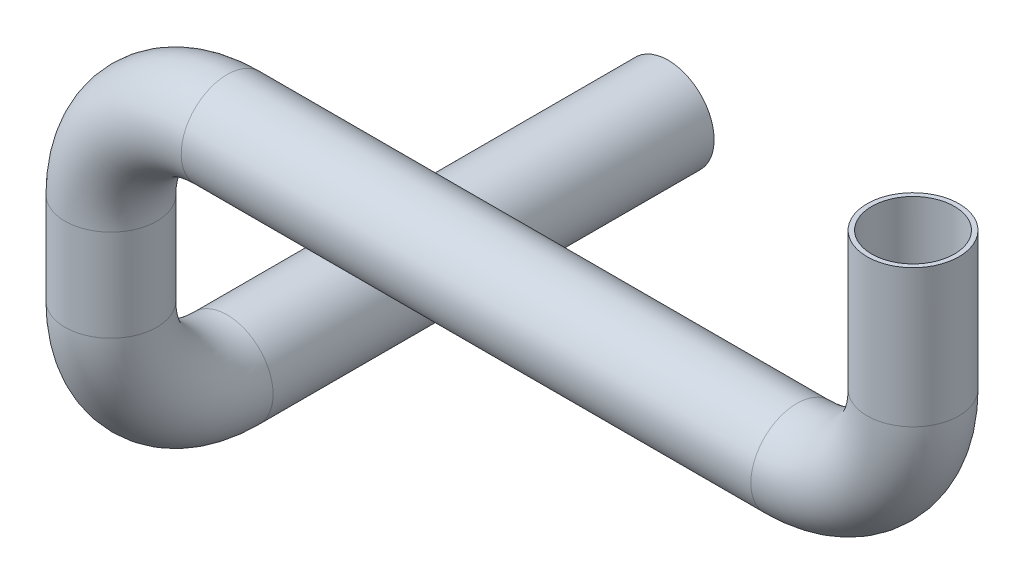
ISO-10303-21;
HEADER;
FILE_DESCRIPTION(('STEP AP214'),'2;1');
FILE_NAME('part.step','',(''),(''),'','','');
FILE_SCHEMA(('AUTOMOTIVE_DESIGN { 1 0 10303 214 1 1 1 1 }'));
ENDSEC;
DATA;
#1=APPLICATION_CONTEXT('core data for automotive mechanical design processes');
#2=APPLICATION_PROTOCOL_DEFINITION('international standard','automotive_design',2000,#1);
#3=PRODUCT_CONTEXT('',#1,'mechanical');
#4=PRODUCT('Part','Part','',(#3));
#5=PRODUCT_RELATED_PRODUCT_CATEGORY('part','',(#4));
#6=PRODUCT_DEFINITION_FORMATION('','',#4);
#7=PRODUCT_DEFINITION_CONTEXT('part definition',#1,'design');
#8=PRODUCT_DEFINITION('design','',#6,#7);
#9=PRODUCT_DEFINITION_SHAPE('','',#8);
#10=(LENGTH_UNIT() NAMED_UNIT(*) SI_UNIT(.MILLI.,.METRE.));
#11=(NAMED_UNIT(*) PLANE_ANGLE_UNIT() SI_UNIT($,.RADIAN.));
#12=(NAMED_UNIT(*) SI_UNIT($,.STERADIAN.) SOLID_ANGLE_UNIT());
#13=UNCERTAINTY_MEASURE_WITH_UNIT(LENGTH_MEASURE(1.E-05),#10,'distance_accuracy_value','');
#14=(GEOMETRIC_REPRESENTATION_CONTEXT(3) GLOBAL_UNCERTAINTY_ASSIGNED_CONTEXT((#13)) GLOBAL_UNIT_ASSIGNED_CONTEXT((#10,
#11,#12)) REPRESENTATION_CONTEXT('',''));
#15=CARTESIAN_POINT('',(0.,0.,0.));
#16=DIRECTION('',(0.,0.,1.));
#17=DIRECTION('',(1.,0.,0.));
#18=AXIS2_PLACEMENT_3D('',#15,#16,#17);
#19=CARTESIAN_POINT('',(87.3,50.3,0.));
#20=DIRECTION('',(0.,1.,0.));
#21=DIRECTION('',(0.,0.,1.));
#22=AXIS2_PLACEMENT_3D('',#19,#20,#21);
#23=PLANE('',#22);
#24=CARTESIAN_POINT('',(87.3,50.3,0.));
#25=DIRECTION('',(0.,1.,0.));
#26=DIRECTION('',(0.,0.,1.));
#27=AXIS2_PLACEMENT_3D('',#24,#25,#26);
#28=CIRCLE('',#27,4.5);
#29=CARTESIAN_POINT('',(87.3,50.3,4.5));
#30=VERTEX_POINT('',#29);
#31=EDGE_CURVE('E61',#30,#30,#28,.T.);
#32=ORIENTED_EDGE('',*,*,#31,.F.);
#33=EDGE_LOOP('',(#32));
#34=FACE_BOUND('',#33,.T.);
#35=CARTESIAN_POINT('',(87.3,50.3,0.));
#36=DIRECTION('',(0.,1.,0.));
#37=DIRECTION('',(0.,0.,1.));
#38=AXIS2_PLACEMENT_3D('',#35,#36,#37);
#39=CIRCLE('',#38,5.);
#40=CARTESIAN_POINT('',(87.3,50.3,5.));
#41=VERTEX_POINT('',#40);
#42=EDGE_CURVE('E10',#41,#41,#39,.T.);
#43=ORIENTED_EDGE('',*,*,#42,.T.);
#44=EDGE_LOOP('',(#43));
#45=FACE_BOUND('',#44,.T.);
#46=ADVANCED_FACE('F30',(#34,#45),#23,.T.);
#47=CARTESIAN_POINT('',(0.,0.,0.));
#48=DIRECTION('',(0.,1.,0.));
#49=DIRECTION('',(0.,0.,1.));
#50=AXIS2_PLACEMENT_3D('',#47,#48,#49);
#51=CYLINDRICAL_SURFACE('',#50,5.);
#52=CARTESIAN_POINT('',(0.,10.,0.));
#53=DIRECTION('',(0.,1.,0.));
#54=DIRECTION('',(0.,0.,1.));
#55=AXIS2_PLACEMENT_3D('',#52,#53,#54);
#56=CIRCLE('',#55,5.);
#57=CARTESIAN_POINT('',(-5.,10.,0.));
#58=VERTEX_POINT('',#57);
#59=EDGE_CURVE('E49',#58,#58,#56,.T.);
#60=ORIENTED_EDGE('',*,*,#59,.F.);
#61=EDGE_LOOP('',(#60));
#62=FACE_BOUND('',#61,.T.);
#63=CARTESIAN_POINT('',(0.,0.,0.));
#64=DIRECTION('',(0.,-1.,0.));
#65=DIRECTION('',(0.,0.,-1.));
#66=AXIS2_PLACEMENT_3D('',#63,#64,#65);
#67=CIRCLE('',#66,5.);
#68=CARTESIAN_POINT('',(0.,0.,5.));
#69=VERTEX_POINT('',#68);
#70=EDGE_CURVE('E58',#69,#69,#67,.T.);
#71=ORIENTED_EDGE('',*,*,#70,.F.);
#72=EDGE_LOOP('',(#71));
#73=FACE_BOUND('',#72,.T.);
#74=ADVANCED_FACE('F127',(#62,#73),#51,.T.);
#75=CARTESIAN_POINT('',(12.65,10.,0.));
#76=DIRECTION('',(0.,0.,-1.));
#77=DIRECTION('',(-1.,0.,0.));
#78=AXIS2_PLACEMENT_3D('',#75,#76,#77);
#79=TOROIDAL_SURFACE('',#78,12.65,5.);
#80=CARTESIAN_POINT('',(12.65,22.65,0.));
#81=DIRECTION('',(1.,0.,0.));
#82=DIRECTION('',(0.,0.,1.));
#83=AXIS2_PLACEMENT_3D('',#80,#81,#82);
#84=CIRCLE('',#83,5.);
#85=CARTESIAN_POINT('',(12.65,27.65,0.));
#86=VERTEX_POINT('',#85);
#87=EDGE_CURVE('E44',#86,#86,#84,.T.);
#88=CARTESIAN_POINT('',(12.65,10.,0.));
#89=DIRECTION('',(0.,0.,-1.));
#90=DIRECTION('',(-1.,0.,0.));
#91=AXIS2_PLACEMENT_3D('',#88,#89,#90);
#92=CIRCLE('',#91,17.65);
#93=EDGE_CURVE('',#58,#86,#92,.T.);
#94=ORIENTED_EDGE('',*,*,#59,.T.);
#95=ORIENTED_EDGE('',*,*,#87,.F.);
#96=ORIENTED_EDGE('',*,*,#93,.T.);
#97=ORIENTED_EDGE('',*,*,#93,.F.);
#98=EDGE_LOOP('',(#94,#96,#95,#97));
#99=FACE_BOUND('',#98,.T.);
#100=ADVANCED_FACE('F123',(#99),#79,.T.);
#101=CARTESIAN_POINT('',(12.65,22.65,0.));
#102=DIRECTION('',(1.,0.,0.));
#103=DIRECTION('',(0.,1.,0.));
#104=AXIS2_PLACEMENT_3D('',#101,#102,#103);
#105=CYLINDRICAL_SURFACE('',#104,5.);
#106=CARTESIAN_POINT('',(74.65,22.65,0.));
#107=DIRECTION('',(1.,0.,0.));
#108=DIRECTION('',(0.,0.,1.));
#109=AXIS2_PLACEMENT_3D('',#106,#107,#108);
#110=CIRCLE('',#109,5.);
#111=CARTESIAN_POINT('',(74.65,17.65,0.));
#112=VERTEX_POINT('',#111);
#113=EDGE_CURVE('E40',#112,#112,#110,.T.);
#114=ORIENTED_EDGE('',*,*,#113,.F.);
#115=EDGE_LOOP('',(#114));
#116=FACE_BOUND('',#115,.T.);
#117=ORIENTED_EDGE('',*,*,#87,.T.);
#118=EDGE_LOOP('',(#117));
#119=FACE_BOUND('',#118,.T.);
#120=ADVANCED_FACE('F117',(#116,#119),#105,.T.);
#121=CARTESIAN_POINT('',(74.65,35.3,0.));
#122=DIRECTION('',(0.,0.,1.));
#123=DIRECTION('',(1.,0.,0.));
#124=AXIS2_PLACEMENT_3D('',#121,#122,#123);
#125=TOROIDAL_SURFACE('',#124,12.65,5.);
#126=CARTESIAN_POINT('',(87.3,35.3,0.));
#127=DIRECTION('',(0.,1.,0.));
#128=DIRECTION('',(0.,0.,1.));
#129=AXIS2_PLACEMENT_3D('',#126,#127,#128);
#130=CIRCLE('',#129,5.);
#131=CARTESIAN_POINT('',(92.3,35.3,0.));
#132=VERTEX_POINT('',#131);
#133=EDGE_CURVE('E36',#132,#132,#130,.T.);
#134=CARTESIAN_POINT('',(74.65,35.3,0.));
#135=DIRECTION('',(0.,0.,1.));
#136=DIRECTION('',(1.,0.,0.));
#137=AXIS2_PLACEMENT_3D('',#134,#135,#136);
#138=CIRCLE('',#137,17.65);
#139=EDGE_CURVE('',#112,#132,#138,.T.);
#140=ORIENTED_EDGE('',*,*,#113,.T.);
#141=ORIENTED_EDGE('',*,*,#133,.F.);
#142=ORIENTED_EDGE('',*,*,#139,.T.);
#143=ORIENTED_EDGE('',*,*,#139,.F.);
#144=EDGE_LOOP('',(#140,#142,#141,#143));
#145=FACE_BOUND('',#144,.T.);
#146=ADVANCED_FACE('F107',(#145),#125,.T.);
#147=CARTESIAN_POINT('',(87.3,35.3,0.));
#148=DIRECTION('',(0.,1.,0.));
#149=DIRECTION('',(0.,0.,1.));
#150=AXIS2_PLACEMENT_3D('',#147,#148,#149);
#151=CYLINDRICAL_SURFACE('',#150,5.);
#152=ORIENTED_EDGE('',*,*,#42,.F.);
#153=EDGE_LOOP('',(#152));
#154=FACE_BOUND('',#153,.T.);
#155=ORIENTED_EDGE('',*,*,#133,.T.);
#156=EDGE_LOOP('',(#155));
#157=FACE_BOUND('',#156,.T.);
#158=ADVANCED_FACE('F104',(#154,#157),#151,.T.);
#159=CARTESIAN_POINT('',(0.,-12.65,-60.65));
#160=DIRECTION('',(0.,0.,-1.));
#161=DIRECTION('',(0.,1.,0.));
#162=AXIS2_PLACEMENT_3D('',#159,#160,#161);
#163=PLANE('',#162);
#164=CARTESIAN_POINT('',(0.,-12.65,-60.65));
#165=DIRECTION('',(0.,0.,-1.));
#166=DIRECTION('',(0.,1.,0.));
#167=AXIS2_PLACEMENT_3D('',#164,#165,#166);
#168=CIRCLE('',#167,4.5);
#169=CARTESIAN_POINT('',(0.,-8.15,-60.65));
#170=VERTEX_POINT('',#169);
#171=EDGE_CURVE('E62',#170,#170,#168,.T.);
#172=ORIENTED_EDGE('',*,*,#171,.F.);
#173=EDGE_LOOP('',(#172));
#174=FACE_BOUND('',#173,.T.);
#175=CARTESIAN_POINT('',(0.,-12.65,-60.65));
#176=DIRECTION('',(0.,0.,-1.));
#177=DIRECTION('',(0.,1.,0.));
#178=AXIS2_PLACEMENT_3D('',#175,#176,#177);
#179=CIRCLE('',#178,5.);
#180=CARTESIAN_POINT('',(0.,-7.65,-60.65));
#181=VERTEX_POINT('',#180);
#182=EDGE_CURVE('E52',#181,#181,#179,.T.);
#183=ORIENTED_EDGE('',*,*,#182,.T.);
#184=EDGE_LOOP('',(#183));
#185=FACE_BOUND('',#184,.T.);
#186=ADVANCED_FACE('F106',(#174,#185),#163,.T.);
#187=CARTESIAN_POINT('',(0.,0.,-12.65));
#188=DIRECTION('',(1.,0.,0.));
#189=DIRECTION('',(0.,0.,-1.));
#190=AXIS2_PLACEMENT_3D('',#187,#188,#189);
#191=TOROIDAL_SURFACE('',#190,12.65,5.);
#192=CARTESIAN_POINT('',(0.,-12.65,-12.65));
#193=DIRECTION('',(0.,0.,-1.));
#194=DIRECTION('',(0.,1.,0.));
#195=AXIS2_PLACEMENT_3D('',#192,#193,#194);
#196=CIRCLE('',#195,5.);
#197=CARTESIAN_POINT('',(0.,-17.65,-12.65));
#198=VERTEX_POINT('',#197);
#199=EDGE_CURVE('E55',#198,#198,#196,.T.);
#200=CARTESIAN_POINT('',(0.,0.,-12.65));
#201=DIRECTION('',(1.,0.,0.));
#202=DIRECTION('',(0.,0.,-1.));
#203=AXIS2_PLACEMENT_3D('',#200,#201,#202);
#204=CIRCLE('',#203,17.65);
#205=EDGE_CURVE('',#69,#198,#204,.T.);
#206=ORIENTED_EDGE('',*,*,#70,.T.);
#207=ORIENTED_EDGE('',*,*,#199,.F.);
#208=ORIENTED_EDGE('',*,*,#205,.T.);
#209=ORIENTED_EDGE('',*,*,#205,.F.);
#210=EDGE_LOOP('',(#206,#208,#207,#209));
#211=FACE_BOUND('',#210,.T.);
#212=ADVANCED_FACE('F113',(#211),#191,.T.);
#213=CARTESIAN_POINT('',(0.,-12.65,-12.65));
#214=DIRECTION('',(0.,0.,-1.));
#215=DIRECTION('',(0.,1.,0.));
#216=AXIS2_PLACEMENT_3D('',#213,#214,#215);
#217=CYLINDRICAL_SURFACE('',#216,5.);
#218=ORIENTED_EDGE('',*,*,#182,.F.);
#219=EDGE_LOOP('',(#218));
#220=FACE_BOUND('',#219,.T.);
#221=ORIENTED_EDGE('',*,*,#199,.T.);
#222=EDGE_LOOP('',(#221));
#223=FACE_BOUND('',#222,.T.);
#224=ADVANCED_FACE('F101',(#220,#223),#217,.T.);
#225=CARTESIAN_POINT('',(0.,0.,0.));
#226=DIRECTION('',(0.,1.,0.));
#227=DIRECTION('',(0.,0.,1.));
#228=AXIS2_PLACEMENT_3D('',#225,#226,#227);
#229=CYLINDRICAL_SURFACE('',#228,4.5);
#230=CARTESIAN_POINT('',(0.,10.,0.));
#231=DIRECTION('',(0.,-1.,0.));
#232=DIRECTION('',(0.,0.,-1.));
#233=AXIS2_PLACEMENT_3D('',#230,#231,#232);
#234=CIRCLE('',#233,4.5);
#235=CARTESIAN_POINT('',(-4.5,10.,0.));
#236=VERTEX_POINT('',#235);
#237=EDGE_CURVE('E65',#236,#236,#234,.F.);
#238=ORIENTED_EDGE('',*,*,#237,.T.);
#239=EDGE_LOOP('',(#238));
#240=FACE_BOUND('',#239,.T.);
#241=CARTESIAN_POINT('',(0.,0.,0.));
#242=DIRECTION('',(0.,1.,0.));
#243=DIRECTION('',(0.,0.,1.));
#244=AXIS2_PLACEMENT_3D('',#241,#242,#243);
#245=CIRCLE('',#244,4.5);
#246=CARTESIAN_POINT('',(0.,0.,4.5));
#247=VERTEX_POINT('',#246);
#248=EDGE_CURVE('E72',#247,#247,#245,.F.);
#249=ORIENTED_EDGE('',*,*,#248,.T.);
#250=EDGE_LOOP('',(#249));
#251=FACE_BOUND('',#250,.T.);
#252=ADVANCED_FACE('F86',(#240,#251),#229,.F.);
#253=CARTESIAN_POINT('',(12.65,10.,0.));
#254=DIRECTION('',(0.,0.,-1.));
#255=DIRECTION('',(-1.,0.,0.));
#256=AXIS2_PLACEMENT_3D('',#253,#254,#255);
#257=TOROIDAL_SURFACE('',#256,12.65,4.5);
#258=CARTESIAN_POINT('',(12.65,22.65,0.));
#259=DIRECTION('',(1.,0.,0.));
#260=DIRECTION('',(0.,1.,0.));
#261=AXIS2_PLACEMENT_3D('',#258,#259,#260);
#262=CIRCLE('',#261,4.5);
#263=CARTESIAN_POINT('',(12.65,27.15,0.));
#264=VERTEX_POINT('',#263);
#265=EDGE_CURVE('E78',#264,#264,#262,.T.);
#266=CARTESIAN_POINT('',(12.65,10.,0.));
#267=DIRECTION('',(0.,0.,-1.));
#268=DIRECTION('',(-1.,0.,0.));
#269=AXIS2_PLACEMENT_3D('',#266,#267,#268);
#270=CIRCLE('',#269,17.15);
#271=EDGE_CURVE('',#236,#264,#270,.T.);
#272=ORIENTED_EDGE('',*,*,#237,.F.);
#273=ORIENTED_EDGE('',*,*,#265,.T.);
#274=ORIENTED_EDGE('',*,*,#271,.T.);
#275=ORIENTED_EDGE('',*,*,#271,.F.);
#276=EDGE_LOOP('',(#272,#274,#273,#275));
#277=FACE_BOUND('',#276,.T.);
#278=ADVANCED_FACE('F89',(#277),#257,.F.);
#279=CARTESIAN_POINT('',(12.65,22.65,0.));
#280=DIRECTION('',(1.,0.,0.));
#281=DIRECTION('',(0.,1.,0.));
#282=AXIS2_PLACEMENT_3D('',#279,#280,#281);
#283=CYLINDRICAL_SURFACE('',#282,4.5);
#284=CARTESIAN_POINT('',(74.65,22.65,0.));
#285=DIRECTION('',(-1.,0.,0.));
#286=DIRECTION('',(0.,-1.,0.));
#287=AXIS2_PLACEMENT_3D('',#284,#285,#286);
#288=CIRCLE('',#287,4.5);
#289=CARTESIAN_POINT('',(74.65,18.15,0.));
#290=VERTEX_POINT('',#289);
#291=EDGE_CURVE('E75',#290,#290,#288,.F.);
#292=ORIENTED_EDGE('',*,*,#291,.T.);
#293=EDGE_LOOP('',(#292));
#294=FACE_BOUND('',#293,.T.);
#295=ORIENTED_EDGE('',*,*,#265,.F.);
#296=EDGE_LOOP('',(#295));
#297=FACE_BOUND('',#296,.T.);
#298=ADVANCED_FACE('F91',(#294,#297),#283,.F.);
#299=CARTESIAN_POINT('',(74.65,35.3,0.));
#300=DIRECTION('',(0.,0.,1.));
#301=DIRECTION('',(1.,0.,0.));
#302=AXIS2_PLACEMENT_3D('',#299,#300,#301);
#303=TOROIDAL_SURFACE('',#302,12.65,4.5);
#304=CARTESIAN_POINT('',(87.3,35.3,0.));
#305=DIRECTION('',(0.,1.,0.));
#306=DIRECTION('',(0.,0.,1.));
#307=AXIS2_PLACEMENT_3D('',#304,#305,#306);
#308=CIRCLE('',#307,4.5);
#309=CARTESIAN_POINT('',(91.8,35.3,0.));
#310=VERTEX_POINT('',#309);
#311=EDGE_CURVE('E69',#310,#310,#308,.T.);
#312=CARTESIAN_POINT('',(74.65,35.3,0.));
#313=DIRECTION('',(0.,0.,1.));
#314=DIRECTION('',(1.,0.,0.));
#315=AXIS2_PLACEMENT_3D('',#312,#313,#314);
#316=CIRCLE('',#315,17.15);
#317=EDGE_CURVE('',#290,#310,#316,.T.);
#318=ORIENTED_EDGE('',*,*,#291,.F.);
#319=ORIENTED_EDGE('',*,*,#311,.T.);
#320=ORIENTED_EDGE('',*,*,#317,.T.);
#321=ORIENTED_EDGE('',*,*,#317,.F.);
#322=EDGE_LOOP('',(#318,#320,#319,#321));
#323=FACE_BOUND('',#322,.T.);
#324=ADVANCED_FACE('F98',(#323),#303,.F.);
#325=CARTESIAN_POINT('',(87.3,35.3,0.));
#326=DIRECTION('',(0.,1.,0.));
#327=DIRECTION('',(0.,0.,1.));
#328=AXIS2_PLACEMENT_3D('',#325,#326,#327);
#329=CYLINDRICAL_SURFACE('',#328,4.5);
#330=ORIENTED_EDGE('',*,*,#31,.T.);
#331=EDGE_LOOP('',(#330));
#332=FACE_BOUND('',#331,.T.);
#333=ORIENTED_EDGE('',*,*,#311,.F.);
#334=EDGE_LOOP('',(#333));
#335=FACE_BOUND('',#334,.T.);
#336=ADVANCED_FACE('F116',(#332,#335),#329,.F.);
#337=CARTESIAN_POINT('',(0.,0.,-12.65));
#338=DIRECTION('',(1.,0.,0.));
#339=DIRECTION('',(0.,0.,-1.));
#340=AXIS2_PLACEMENT_3D('',#337,#338,#339);
#341=TOROIDAL_SURFACE('',#340,12.65,4.5);
#342=CARTESIAN_POINT('',(0.,-12.65,-12.65));
#343=DIRECTION('',(0.,0.,-1.));
#344=DIRECTION('',(0.,1.,0.));
#345=AXIS2_PLACEMENT_3D('',#342,#343,#344);
#346=CIRCLE('',#345,4.5);
#347=CARTESIAN_POINT('',(0.,-17.15,-12.65));
#348=VERTEX_POINT('',#347);
#349=EDGE_CURVE('E66',#348,#348,#346,.T.);
#350=CARTESIAN_POINT('',(0.,0.,-12.65));
#351=DIRECTION('',(1.,0.,0.));
#352=DIRECTION('',(0.,0.,-1.));
#353=AXIS2_PLACEMENT_3D('',#350,#351,#352);
#354=CIRCLE('',#353,17.15);
#355=EDGE_CURVE('',#247,#348,#354,.T.);
#356=ORIENTED_EDGE('',*,*,#248,.F.);
#357=ORIENTED_EDGE('',*,*,#349,.T.);
#358=ORIENTED_EDGE('',*,*,#355,.T.);
#359=ORIENTED_EDGE('',*,*,#355,.F.);
#360=EDGE_LOOP('',(#356,#358,#357,#359));
#361=FACE_BOUND('',#360,.T.);
#362=ADVANCED_FACE('F140',(#361),#341,.F.);
#363=CARTESIAN_POINT('',(0.,-12.65,-12.65));
#364=DIRECTION('',(0.,0.,-1.));
#365=DIRECTION('',(0.,1.,0.));
#366=AXIS2_PLACEMENT_3D('',#363,#364,#365);
#367=CYLINDRICAL_SURFACE('',#366,4.5);
#368=ORIENTED_EDGE('',*,*,#171,.T.);
#369=EDGE_LOOP('',(#368));
#370=FACE_BOUND('',#369,.T.);
#371=ORIENTED_EDGE('',*,*,#349,.F.);
#372=EDGE_LOOP('',(#371));
#373=FACE_BOUND('',#372,.T.);
#374=ADVANCED_FACE('F103',(#370,#373),#367,.F.);
#375=CLOSED_SHELL('',(#46,#74,#100,#120,#146,#158,#186,#212,#224,#252,#278,#298,#324,#336,#362,#374));
#376=MANIFOLD_SOLID_BREP('B2',#375);
#377=ADVANCED_BREP_SHAPE_REPRESENTATION('',(#18,#376),#14);
#378=SHAPE_DEFINITION_REPRESENTATION(#9,#377);
ENDSEC;
END-ISO-10303-21;
